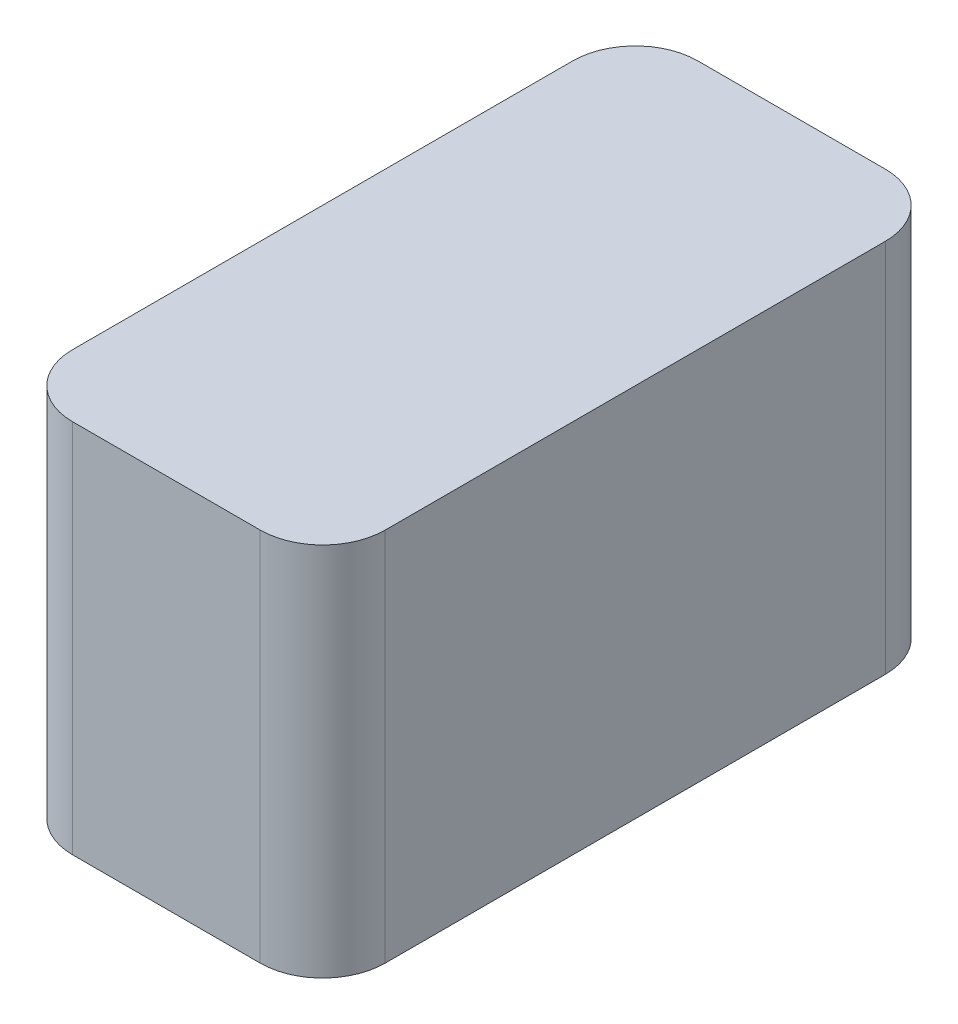
ISO-10303-21;
HEADER;
FILE_DESCRIPTION(('STEP AP214'),'2;1');
FILE_NAME('part.step','',(''),(''),'','','');
FILE_SCHEMA(('AUTOMOTIVE_DESIGN { 1 0 10303 214 1 1 1 1 }'));
ENDSEC;
DATA;
#1=APPLICATION_CONTEXT('core data for automotive mechanical design processes');
#2=APPLICATION_PROTOCOL_DEFINITION('international standard','automotive_design',2000,#1);
#3=PRODUCT_CONTEXT('',#1,'mechanical');
#4=PRODUCT('Part','Part','',(#3));
#5=PRODUCT_RELATED_PRODUCT_CATEGORY('part','',(#4));
#6=PRODUCT_DEFINITION_FORMATION('','',#4);
#7=PRODUCT_DEFINITION_CONTEXT('part definition',#1,'design');
#8=PRODUCT_DEFINITION('design','',#6,#7);
#9=PRODUCT_DEFINITION_SHAPE('','',#8);
#10=(LENGTH_UNIT() NAMED_UNIT(*) SI_UNIT(.MILLI.,.METRE.));
#11=(NAMED_UNIT(*) PLANE_ANGLE_UNIT() SI_UNIT($,.RADIAN.));
#12=(NAMED_UNIT(*) SI_UNIT($,.STERADIAN.) SOLID_ANGLE_UNIT());
#13=UNCERTAINTY_MEASURE_WITH_UNIT(LENGTH_MEASURE(1.E-05),#10,'distance_accuracy_value','');
#14=(GEOMETRIC_REPRESENTATION_CONTEXT(3) GLOBAL_UNCERTAINTY_ASSIGNED_CONTEXT((#13)) GLOBAL_UNIT_ASSIGNED_CONTEXT((#10,
#11,#12)) REPRESENTATION_CONTEXT('',''));
#15=CARTESIAN_POINT('',(0.,0.,0.));
#16=DIRECTION('',(0.,0.,1.));
#17=DIRECTION('',(1.,0.,0.));
#18=AXIS2_PLACEMENT_3D('',#15,#16,#17);
#19=CARTESIAN_POINT('',(1.5,6.,4.));
#20=DIRECTION('',(0.,-1.,0.));
#21=DIRECTION('',(0.,0.,-1.));
#22=AXIS2_PLACEMENT_3D('',#19,#20,#21);
#23=CYLINDRICAL_SURFACE('',#22,0.999999999999999);
#24=CARTESIAN_POINT('',(1.5,0.,4.));
#25=DIRECTION('',(0.,1.,0.));
#26=DIRECTION('',(0.,0.,1.));
#27=AXIS2_PLACEMENT_3D('',#24,#25,#26);
#28=CIRCLE('',#27,0.999999999999999);
#29=CARTESIAN_POINT('',(1.5,0.,5.));
#30=VERTEX_POINT('',#29);
#31=CARTESIAN_POINT('',(2.5,0.,4.));
#32=VERTEX_POINT('',#31);
#33=EDGE_CURVE('E140',#30,#32,#28,.T.);
#34=ORIENTED_EDGE('',*,*,#33,.T.);
#35=DIRECTION('',(0.,-1.,0.));
#36=VECTOR('',#35,1.);
#37=CARTESIAN_POINT('',(2.5,6.,4.));
#38=LINE('',#37,#36);
#39=CARTESIAN_POINT('',(2.5,6.,4.));
#40=VERTEX_POINT('',#39);
#41=EDGE_CURVE('E11',#40,#32,#38,.T.);
#42=ORIENTED_EDGE('',*,*,#41,.F.);
#43=CARTESIAN_POINT('',(1.5,6.,4.));
#44=DIRECTION('',(0.,1.,0.));
#45=DIRECTION('',(0.,0.,1.));
#46=AXIS2_PLACEMENT_3D('',#43,#44,#45);
#47=CIRCLE('',#46,0.999999999999999);
#48=CARTESIAN_POINT('',(1.5,6.,5.));
#49=VERTEX_POINT('',#48);
#50=EDGE_CURVE('E162',#49,#40,#47,.T.);
#51=ORIENTED_EDGE('',*,*,#50,.F.);
#52=DIRECTION('',(0.,-1.,0.));
#53=VECTOR('',#52,1.);
#54=CARTESIAN_POINT('',(1.5,6.,5.));
#55=LINE('',#54,#53);
#56=EDGE_CURVE('E136',#49,#30,#55,.T.);
#57=ORIENTED_EDGE('',*,*,#56,.T.);
#58=EDGE_LOOP('',(#34,#42,#51,#57));
#59=FACE_BOUND('',#58,.T.);
#60=ADVANCED_FACE('F39',(#59),#23,.T.);
#61=CARTESIAN_POINT('',(2.5,6.,-4.));
#62=DIRECTION('',(-1.,0.,0.));
#63=DIRECTION('',(0.,0.,1.));
#64=AXIS2_PLACEMENT_3D('',#61,#62,#63);
#65=PLANE('',#64);
#66=DIRECTION('',(0.,0.,-1.));
#67=VECTOR('',#66,1.);
#68=CARTESIAN_POINT('',(2.5,0.,-4.));
#69=LINE('',#68,#67);
#70=CARTESIAN_POINT('',(2.5,0.,-4.));
#71=VERTEX_POINT('',#70);
#72=EDGE_CURVE('E144',#32,#71,#69,.T.);
#73=ORIENTED_EDGE('',*,*,#72,.T.);
#74=DIRECTION('',(0.,-1.,0.));
#75=VECTOR('',#74,1.);
#76=CARTESIAN_POINT('',(2.5,6.,-4.));
#77=LINE('',#76,#75);
#78=CARTESIAN_POINT('',(2.5,6.,-4.));
#79=VERTEX_POINT('',#78);
#80=EDGE_CURVE('E48',#79,#71,#77,.T.);
#81=ORIENTED_EDGE('',*,*,#80,.F.);
#82=DIRECTION('',(0.,0.,-1.));
#83=VECTOR('',#82,1.);
#84=CARTESIAN_POINT('',(2.5,6.,-4.));
#85=LINE('',#84,#83);
#86=EDGE_CURVE('E99',#40,#79,#85,.T.);
#87=ORIENTED_EDGE('',*,*,#86,.F.);
#88=ORIENTED_EDGE('',*,*,#41,.T.);
#89=EDGE_LOOP('',(#73,#81,#87,#88));
#90=FACE_BOUND('',#89,.T.);
#91=ADVANCED_FACE('F208',(#90),#65,.F.);
#92=CARTESIAN_POINT('',(1.5,6.,-4.));
#93=DIRECTION('',(0.,-1.,0.));
#94=DIRECTION('',(0.,0.,-1.));
#95=AXIS2_PLACEMENT_3D('',#92,#93,#94);
#96=CYLINDRICAL_SURFACE('',#95,0.999999999999999);
#97=CARTESIAN_POINT('',(1.5,0.,-4.));
#98=DIRECTION('',(0.,1.,0.));
#99=DIRECTION('',(0.,0.,-1.));
#100=AXIS2_PLACEMENT_3D('',#97,#98,#99);
#101=CIRCLE('',#100,0.999999999999999);
#102=CARTESIAN_POINT('',(1.5,0.,-5.));
#103=VERTEX_POINT('',#102);
#104=EDGE_CURVE('E147',#71,#103,#101,.T.);
#105=ORIENTED_EDGE('',*,*,#104,.T.);
#106=DIRECTION('',(0.,-1.,0.));
#107=VECTOR('',#106,1.);
#108=CARTESIAN_POINT('',(1.5,6.,-5.));
#109=LINE('',#108,#107);
#110=CARTESIAN_POINT('',(1.5,6.,-5.));
#111=VERTEX_POINT('',#110);
#112=EDGE_CURVE('E173',#111,#103,#109,.T.);
#113=ORIENTED_EDGE('',*,*,#112,.F.);
#114=CARTESIAN_POINT('',(1.5,6.,-4.));
#115=DIRECTION('',(0.,1.,0.));
#116=DIRECTION('',(0.,0.,-1.));
#117=AXIS2_PLACEMENT_3D('',#114,#115,#116);
#118=CIRCLE('',#117,0.999999999999999);
#119=EDGE_CURVE('E183',#79,#111,#118,.T.);
#120=ORIENTED_EDGE('',*,*,#119,.F.);
#121=ORIENTED_EDGE('',*,*,#80,.T.);
#122=EDGE_LOOP('',(#105,#113,#120,#121));
#123=FACE_BOUND('',#122,.T.);
#124=ADVANCED_FACE('F181',(#123),#96,.T.);
#125=CARTESIAN_POINT('',(-1.5,6.,-5.));
#126=DIRECTION('',(0.,0.,1.));
#127=DIRECTION('',(1.,0.,0.));
#128=AXIS2_PLACEMENT_3D('',#125,#126,#127);
#129=PLANE('',#128);
#130=DIRECTION('',(-1.,0.,0.));
#131=VECTOR('',#130,1.);
#132=CARTESIAN_POINT('',(-1.5,0.,-5.));
#133=LINE('',#132,#131);
#134=CARTESIAN_POINT('',(-1.5,0.,-5.));
#135=VERTEX_POINT('',#134);
#136=EDGE_CURVE('E150',#103,#135,#133,.T.);
#137=ORIENTED_EDGE('',*,*,#136,.T.);
#138=DIRECTION('',(0.,-1.,0.));
#139=VECTOR('',#138,1.);
#140=CARTESIAN_POINT('',(-1.5,6.,-5.));
#141=LINE('',#140,#139);
#142=CARTESIAN_POINT('',(-1.5,6.,-5.));
#143=VERTEX_POINT('',#142);
#144=EDGE_CURVE('E169',#143,#135,#141,.T.);
#145=ORIENTED_EDGE('',*,*,#144,.F.);
#146=DIRECTION('',(-1.,0.,0.));
#147=VECTOR('',#146,1.);
#148=CARTESIAN_POINT('',(-1.5,6.,-5.));
#149=LINE('',#148,#147);
#150=EDGE_CURVE('E196',#111,#143,#149,.T.);
#151=ORIENTED_EDGE('',*,*,#150,.F.);
#152=ORIENTED_EDGE('',*,*,#112,.T.);
#153=EDGE_LOOP('',(#137,#145,#151,#152));
#154=FACE_BOUND('',#153,.T.);
#155=ADVANCED_FACE('F191',(#154),#129,.F.);
#156=CARTESIAN_POINT('',(-1.5,6.,-4.));
#157=DIRECTION('',(0.,-1.,0.));
#158=DIRECTION('',(0.,0.,-1.));
#159=AXIS2_PLACEMENT_3D('',#156,#157,#158);
#160=CYLINDRICAL_SURFACE('',#159,0.999999999999999);
#161=CARTESIAN_POINT('',(-1.5,0.,-4.));
#162=DIRECTION('',(0.,1.,0.));
#163=DIRECTION('',(0.,0.,1.));
#164=AXIS2_PLACEMENT_3D('',#161,#162,#163);
#165=CIRCLE('',#164,0.999999999999999);
#166=CARTESIAN_POINT('',(-2.5,0.,-4.));
#167=VERTEX_POINT('',#166);
#168=EDGE_CURVE('E153',#135,#167,#165,.T.);
#169=ORIENTED_EDGE('',*,*,#168,.T.);
#170=DIRECTION('',(0.,-1.,0.));
#171=VECTOR('',#170,1.);
#172=CARTESIAN_POINT('',(-2.5,6.,-4.));
#173=LINE('',#172,#171);
#174=CARTESIAN_POINT('',(-2.5,6.,-4.));
#175=VERTEX_POINT('',#174);
#176=EDGE_CURVE('E129',#175,#167,#173,.T.);
#177=ORIENTED_EDGE('',*,*,#176,.F.);
#178=CARTESIAN_POINT('',(-1.5,6.,-4.));
#179=DIRECTION('',(0.,1.,0.));
#180=DIRECTION('',(0.,0.,1.));
#181=AXIS2_PLACEMENT_3D('',#178,#179,#180);
#182=CIRCLE('',#181,0.999999999999999);
#183=EDGE_CURVE('E118',#143,#175,#182,.T.);
#184=ORIENTED_EDGE('',*,*,#183,.F.);
#185=ORIENTED_EDGE('',*,*,#144,.T.);
#186=EDGE_LOOP('',(#169,#177,#184,#185));
#187=FACE_BOUND('',#186,.T.);
#188=ADVANCED_FACE('F194',(#187),#160,.T.);
#189=CARTESIAN_POINT('',(-2.5,6.,-4.));
#190=DIRECTION('',(1.,0.,0.));
#191=DIRECTION('',(0.,0.,-1.));
#192=AXIS2_PLACEMENT_3D('',#189,#190,#191);
#193=PLANE('',#192);
#194=DIRECTION('',(0.,0.,1.));
#195=VECTOR('',#194,1.);
#196=CARTESIAN_POINT('',(-2.5,0.,-4.));
#197=LINE('',#196,#195);
#198=CARTESIAN_POINT('',(-2.5,0.,4.));
#199=VERTEX_POINT('',#198);
#200=EDGE_CURVE('E127',#167,#199,#197,.T.);
#201=ORIENTED_EDGE('',*,*,#200,.T.);
#202=DIRECTION('',(0.,-1.,0.));
#203=VECTOR('',#202,1.);
#204=CARTESIAN_POINT('',(-2.5,6.,4.));
#205=LINE('',#204,#203);
#206=CARTESIAN_POINT('',(-2.5,6.,4.));
#207=VERTEX_POINT('',#206);
#208=EDGE_CURVE('E124',#207,#199,#205,.T.);
#209=ORIENTED_EDGE('',*,*,#208,.F.);
#210=DIRECTION('',(0.,0.,1.));
#211=VECTOR('',#210,1.);
#212=CARTESIAN_POINT('',(-2.5,6.,-4.));
#213=LINE('',#212,#211);
#214=EDGE_CURVE('E112',#175,#207,#213,.T.);
#215=ORIENTED_EDGE('',*,*,#214,.F.);
#216=ORIENTED_EDGE('',*,*,#176,.T.);
#217=EDGE_LOOP('',(#201,#209,#215,#216));
#218=FACE_BOUND('',#217,.T.);
#219=ADVANCED_FACE('F125',(#218),#193,.F.);
#220=CARTESIAN_POINT('',(-1.5,6.,4.));
#221=DIRECTION('',(0.,-1.,0.));
#222=DIRECTION('',(0.,0.,-1.));
#223=AXIS2_PLACEMENT_3D('',#220,#221,#222);
#224=CYLINDRICAL_SURFACE('',#223,0.999999999999999);
#225=CARTESIAN_POINT('',(-1.5,0.,4.));
#226=DIRECTION('',(0.,1.,0.));
#227=DIRECTION('',(0.,0.,1.));
#228=AXIS2_PLACEMENT_3D('',#225,#226,#227);
#229=CIRCLE('',#228,0.999999999999999);
#230=CARTESIAN_POINT('',(-1.5,0.,5.));
#231=VERTEX_POINT('',#230);
#232=EDGE_CURVE('E85',#199,#231,#229,.T.);
#233=ORIENTED_EDGE('',*,*,#232,.T.);
#234=DIRECTION('',(0.,-1.,0.));
#235=VECTOR('',#234,1.);
#236=CARTESIAN_POINT('',(-1.5,6.,5.));
#237=LINE('',#236,#235);
#238=CARTESIAN_POINT('',(-1.5,6.,5.));
#239=VERTEX_POINT('',#238);
#240=EDGE_CURVE('E130',#239,#231,#237,.T.);
#241=ORIENTED_EDGE('',*,*,#240,.F.);
#242=CARTESIAN_POINT('',(-1.5,6.,4.));
#243=DIRECTION('',(0.,1.,0.));
#244=DIRECTION('',(0.,0.,1.));
#245=AXIS2_PLACEMENT_3D('',#242,#243,#244);
#246=CIRCLE('',#245,0.999999999999999);
#247=EDGE_CURVE('E116',#207,#239,#246,.T.);
#248=ORIENTED_EDGE('',*,*,#247,.F.);
#249=ORIENTED_EDGE('',*,*,#208,.T.);
#250=EDGE_LOOP('',(#233,#241,#248,#249));
#251=FACE_BOUND('',#250,.T.);
#252=ADVANCED_FACE('F132',(#251),#224,.T.);
#253=CARTESIAN_POINT('',(-1.5,6.,5.));
#254=DIRECTION('',(0.,0.,-1.));
#255=DIRECTION('',(-1.,0.,0.));
#256=AXIS2_PLACEMENT_3D('',#253,#254,#255);
#257=PLANE('',#256);
#258=DIRECTION('',(1.,0.,0.));
#259=VECTOR('',#258,1.);
#260=CARTESIAN_POINT('',(-1.5,0.,5.));
#261=LINE('',#260,#259);
#262=EDGE_CURVE('E91',#231,#30,#261,.T.);
#263=ORIENTED_EDGE('',*,*,#262,.T.);
#264=ORIENTED_EDGE('',*,*,#56,.F.);
#265=DIRECTION('',(1.,0.,0.));
#266=VECTOR('',#265,1.);
#267=CARTESIAN_POINT('',(-1.5,6.,5.));
#268=LINE('',#267,#266);
#269=EDGE_CURVE('E56',#239,#49,#268,.T.);
#270=ORIENTED_EDGE('',*,*,#269,.F.);
#271=ORIENTED_EDGE('',*,*,#240,.T.);
#272=EDGE_LOOP('',(#263,#264,#270,#271));
#273=FACE_BOUND('',#272,.T.);
#274=ADVANCED_FACE('F224',(#273),#257,.F.);
#275=CARTESIAN_POINT('',(1.5,6.,4.));
#276=DIRECTION('',(0.,1.,0.));
#277=DIRECTION('',(0.,0.,1.));
#278=AXIS2_PLACEMENT_3D('',#275,#276,#277);
#279=PLANE('',#278);
#280=ORIENTED_EDGE('',*,*,#50,.T.);
#281=ORIENTED_EDGE('',*,*,#86,.T.);
#282=ORIENTED_EDGE('',*,*,#119,.T.);
#283=ORIENTED_EDGE('',*,*,#150,.T.);
#284=ORIENTED_EDGE('',*,*,#183,.T.);
#285=ORIENTED_EDGE('',*,*,#214,.T.);
#286=ORIENTED_EDGE('',*,*,#247,.T.);
#287=ORIENTED_EDGE('',*,*,#269,.T.);
#288=EDGE_LOOP('',(#280,#281,#282,#283,#284,#285,#286,#287));
#289=FACE_BOUND('',#288,.T.);
#290=ADVANCED_FACE('F114',(#289),#279,.T.);
#291=CARTESIAN_POINT('',(1.5,0.,4.));
#292=DIRECTION('',(0.,1.,0.));
#293=DIRECTION('',(0.,0.,1.));
#294=AXIS2_PLACEMENT_3D('',#291,#292,#293);
#295=PLANE('',#294);
#296=ORIENTED_EDGE('',*,*,#33,.F.);
#297=ORIENTED_EDGE('',*,*,#262,.F.);
#298=ORIENTED_EDGE('',*,*,#232,.F.);
#299=ORIENTED_EDGE('',*,*,#200,.F.);
#300=ORIENTED_EDGE('',*,*,#168,.F.);
#301=ORIENTED_EDGE('',*,*,#136,.F.);
#302=ORIENTED_EDGE('',*,*,#104,.F.);
#303=ORIENTED_EDGE('',*,*,#72,.F.);
#304=EDGE_LOOP('',(#296,#297,#298,#299,#300,#301,#302,#303));
#305=FACE_BOUND('',#304,.T.);
#306=ADVANCED_FACE('F187',(#305),#295,.F.);
#307=CLOSED_SHELL('',(#60,#91,#124,#155,#188,#219,#252,#274,#290,#306));
#308=MANIFOLD_SOLID_BREP('B2',#307);
#309=ADVANCED_BREP_SHAPE_REPRESENTATION('',(#18,#308),#14);
#310=SHAPE_DEFINITION_REPRESENTATION(#9,#309);
ENDSEC;
END-ISO-10303-21;
